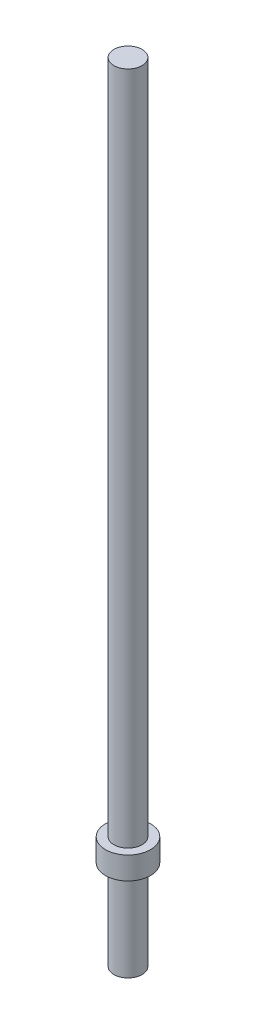
ISO-10303-21;
HEADER;
FILE_DESCRIPTION(('STEP AP214'),'2;1');
FILE_NAME('part.step','',(''),(''),'','','');
FILE_SCHEMA(('AUTOMOTIVE_DESIGN { 1 0 10303 214 1 1 1 1 }'));
ENDSEC;
DATA;
#1=APPLICATION_CONTEXT('core data for automotive mechanical design processes');
#2=APPLICATION_PROTOCOL_DEFINITION('international standard','automotive_design',2000,#1);
#3=PRODUCT_CONTEXT('',#1,'mechanical');
#4=PRODUCT('Part','Part','',(#3));
#5=PRODUCT_RELATED_PRODUCT_CATEGORY('part','',(#4));
#6=PRODUCT_DEFINITION_FORMATION('','',#4);
#7=PRODUCT_DEFINITION_CONTEXT('part definition',#1,'design');
#8=PRODUCT_DEFINITION('design','',#6,#7);
#9=PRODUCT_DEFINITION_SHAPE('','',#8);
#10=(LENGTH_UNIT() NAMED_UNIT(*) SI_UNIT(.MILLI.,.METRE.));
#11=(NAMED_UNIT(*) PLANE_ANGLE_UNIT() SI_UNIT($,.RADIAN.));
#12=(NAMED_UNIT(*) SI_UNIT($,.STERADIAN.) SOLID_ANGLE_UNIT());
#13=UNCERTAINTY_MEASURE_WITH_UNIT(LENGTH_MEASURE(1.E-05),#10,'distance_accuracy_value','');
#14=(GEOMETRIC_REPRESENTATION_CONTEXT(3) GLOBAL_UNCERTAINTY_ASSIGNED_CONTEXT((#13)) GLOBAL_UNIT_ASSIGNED_CONTEXT((#10,
#11,#12)) REPRESENTATION_CONTEXT('',''));
#15=CARTESIAN_POINT('',(0.,0.,0.));
#16=DIRECTION('',(0.,0.,1.));
#17=DIRECTION('',(1.,0.,0.));
#18=AXIS2_PLACEMENT_3D('',#15,#16,#17);
#19=CARTESIAN_POINT('',(0.,120.,0.));
#20=DIRECTION('',(0.,-1.,0.));
#21=DIRECTION('',(0.,0.,-1.));
#22=AXIS2_PLACEMENT_3D('',#19,#20,#21);
#23=CYLINDRICAL_SURFACE('',#22,2.5);
#24=CARTESIAN_POINT('',(0.,120.,0.));
#25=DIRECTION('',(0.,1.,0.));
#26=DIRECTION('',(0.,0.,1.));
#27=AXIS2_PLACEMENT_3D('',#24,#25,#26);
#28=CIRCLE('',#27,2.5);
#29=CARTESIAN_POINT('',(0.,120.,2.5));
#30=VERTEX_POINT('',#29);
#31=EDGE_CURVE('E10',#30,#30,#28,.T.);
#32=ORIENTED_EDGE('',*,*,#31,.F.);
#33=EDGE_LOOP('',(#32));
#34=FACE_BOUND('',#33,.T.);
#35=CARTESIAN_POINT('',(0.,0.,0.));
#36=DIRECTION('',(0.,1.,0.));
#37=DIRECTION('',(0.,0.,1.));
#38=AXIS2_PLACEMENT_3D('',#35,#36,#37);
#39=CIRCLE('',#38,2.5);
#40=CARTESIAN_POINT('',(0.,0.,2.5));
#41=VERTEX_POINT('',#40);
#42=EDGE_CURVE('E38',#41,#41,#39,.T.);
#43=ORIENTED_EDGE('',*,*,#42,.T.);
#44=EDGE_LOOP('',(#43));
#45=FACE_BOUND('',#44,.T.);
#46=ADVANCED_FACE('F32',(#34,#45),#23,.T.);
#47=CARTESIAN_POINT('',(0.,120.,0.));
#48=DIRECTION('',(0.,1.,0.));
#49=DIRECTION('',(0.,0.,1.));
#50=AXIS2_PLACEMENT_3D('',#47,#48,#49);
#51=PLANE('',#50);
#52=ORIENTED_EDGE('',*,*,#31,.T.);
#53=EDGE_LOOP('',(#52));
#54=FACE_BOUND('',#53,.T.);
#55=ADVANCED_FACE('F70',(#54),#51,.T.);
#56=CARTESIAN_POINT('',(0.,-4.,0.));
#57=DIRECTION('',(0.,1.,0.));
#58=DIRECTION('',(0.,0.,1.));
#59=AXIS2_PLACEMENT_3D('',#56,#57,#58);
#60=CYLINDRICAL_SURFACE('',#59,4.);
#61=CARTESIAN_POINT('',(0.,-4.,0.));
#62=DIRECTION('',(0.,1.,0.));
#63=DIRECTION('',(0.,0.,1.));
#64=AXIS2_PLACEMENT_3D('',#61,#62,#63);
#65=CIRCLE('',#64,4.);
#66=CARTESIAN_POINT('',(0.,-4.,4.));
#67=VERTEX_POINT('',#66);
#68=EDGE_CURVE('E42',#67,#67,#65,.T.);
#69=ORIENTED_EDGE('',*,*,#68,.T.);
#70=EDGE_LOOP('',(#69));
#71=FACE_BOUND('',#70,.T.);
#72=CARTESIAN_POINT('',(0.,0.,0.));
#73=DIRECTION('',(0.,1.,0.));
#74=DIRECTION('',(0.,0.,1.));
#75=AXIS2_PLACEMENT_3D('',#72,#73,#74);
#76=CIRCLE('',#75,4.);
#77=CARTESIAN_POINT('',(0.,0.,4.));
#78=VERTEX_POINT('',#77);
#79=EDGE_CURVE('E46',#78,#78,#76,.T.);
#80=ORIENTED_EDGE('',*,*,#79,.F.);
#81=EDGE_LOOP('',(#80));
#82=FACE_BOUND('',#81,.T.);
#83=ADVANCED_FACE('F75',(#71,#82),#60,.T.);
#84=CARTESIAN_POINT('',(0.,-4.,0.));
#85=DIRECTION('',(0.,1.,0.));
#86=DIRECTION('',(0.,0.,1.));
#87=AXIS2_PLACEMENT_3D('',#84,#85,#86);
#88=PLANE('',#87);
#89=CARTESIAN_POINT('',(0.,-4.,0.));
#90=DIRECTION('',(0.,1.,0.));
#91=DIRECTION('',(0.,0.,1.));
#92=AXIS2_PLACEMENT_3D('',#89,#90,#91);
#93=CIRCLE('',#92,2.5);
#94=CARTESIAN_POINT('',(0.,-4.,2.5));
#95=VERTEX_POINT('',#94);
#96=EDGE_CURVE('E50',#95,#95,#93,.T.);
#97=ORIENTED_EDGE('',*,*,#96,.T.);
#98=EDGE_LOOP('',(#97));
#99=FACE_BOUND('',#98,.T.);
#100=ORIENTED_EDGE('',*,*,#68,.F.);
#101=EDGE_LOOP('',(#100));
#102=FACE_BOUND('',#101,.T.);
#103=ADVANCED_FACE('F79',(#99,#102),#88,.F.);
#104=CARTESIAN_POINT('',(0.,0.,0.));
#105=DIRECTION('',(0.,1.,0.));
#106=DIRECTION('',(0.,0.,1.));
#107=AXIS2_PLACEMENT_3D('',#104,#105,#106);
#108=PLANE('',#107);
#109=ORIENTED_EDGE('',*,*,#42,.F.);
#110=EDGE_LOOP('',(#109));
#111=FACE_BOUND('',#110,.T.);
#112=ORIENTED_EDGE('',*,*,#79,.T.);
#113=EDGE_LOOP('',(#112));
#114=FACE_BOUND('',#113,.T.);
#115=ADVANCED_FACE('F67',(#111,#114),#108,.T.);
#116=CARTESIAN_POINT('',(0.,-20.,0.));
#117=DIRECTION('',(0.,1.,0.));
#118=DIRECTION('',(0.,0.,1.));
#119=AXIS2_PLACEMENT_3D('',#116,#117,#118);
#120=CYLINDRICAL_SURFACE('',#119,2.5);
#121=CARTESIAN_POINT('',(0.,-20.,0.));
#122=DIRECTION('',(0.,1.,0.));
#123=DIRECTION('',(0.,0.,1.));
#124=AXIS2_PLACEMENT_3D('',#121,#122,#123);
#125=CIRCLE('',#124,2.5);
#126=CARTESIAN_POINT('',(0.,-20.,2.5));
#127=VERTEX_POINT('',#126);
#128=EDGE_CURVE('E54',#127,#127,#125,.T.);
#129=ORIENTED_EDGE('',*,*,#128,.T.);
#130=EDGE_LOOP('',(#129));
#131=FACE_BOUND('',#130,.T.);
#132=ORIENTED_EDGE('',*,*,#96,.F.);
#133=EDGE_LOOP('',(#132));
#134=FACE_BOUND('',#133,.T.);
#135=ADVANCED_FACE('F58',(#131,#134),#120,.T.);
#136=CARTESIAN_POINT('',(0.,-20.,0.));
#137=DIRECTION('',(0.,1.,0.));
#138=DIRECTION('',(0.,0.,1.));
#139=AXIS2_PLACEMENT_3D('',#136,#137,#138);
#140=PLANE('',#139);
#141=ORIENTED_EDGE('',*,*,#128,.F.);
#142=EDGE_LOOP('',(#141));
#143=FACE_BOUND('',#142,.T.);
#144=ADVANCED_FACE('F61',(#143),#140,.F.);
#145=CLOSED_SHELL('',(#46,#55,#83,#103,#115,#135,#144));
#146=MANIFOLD_SOLID_BREP('B2',#145);
#147=ADVANCED_BREP_SHAPE_REPRESENTATION('',(#18,#146),#14);
#148=SHAPE_DEFINITION_REPRESENTATION(#9,#147);
ENDSEC;
END-ISO-10303-21;
